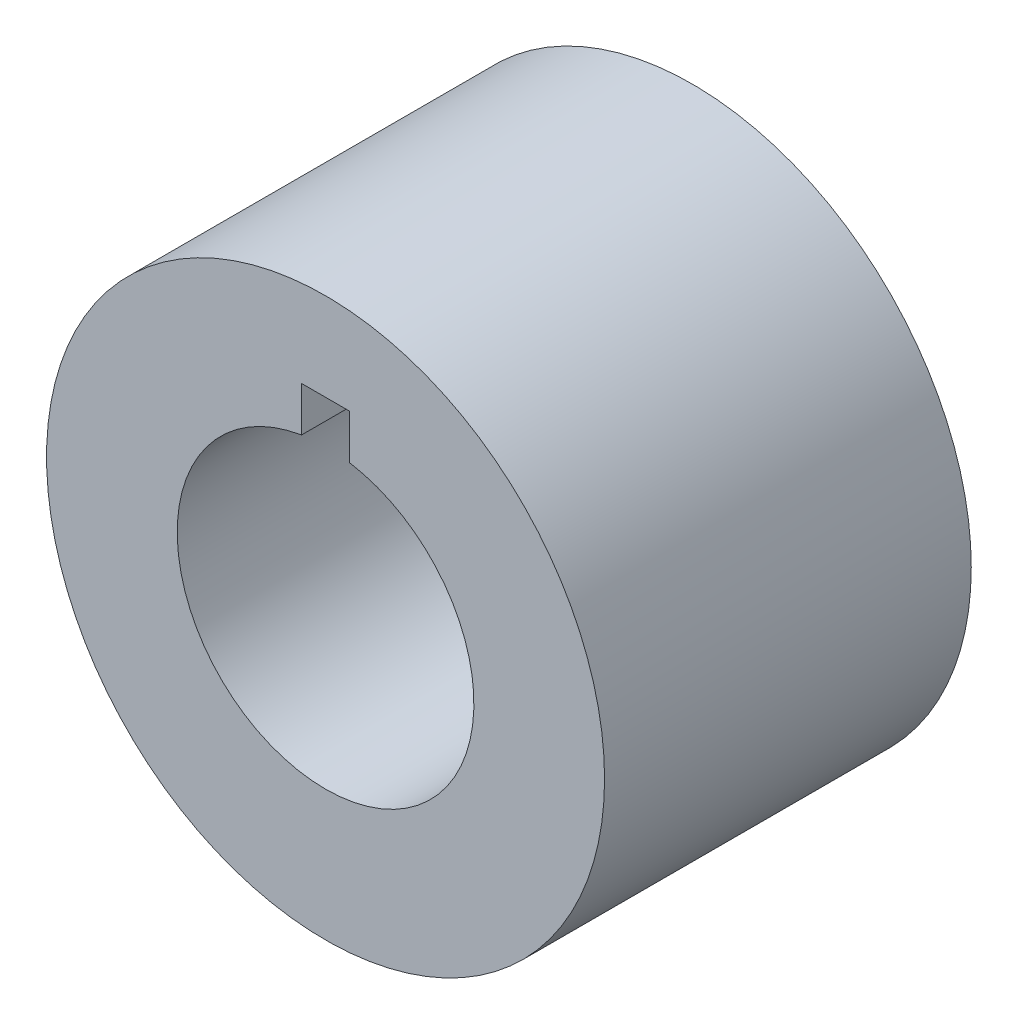
ISO-10303-21;
HEADER;
FILE_DESCRIPTION(('STEP AP214'),'2;1');
FILE_NAME('part.step','',(''),(''),'','','');
FILE_SCHEMA(('AUTOMOTIVE_DESIGN { 1 0 10303 214 1 1 1 1 }'));
ENDSEC;
DATA;
#1=APPLICATION_CONTEXT('core data for automotive mechanical design processes');
#2=APPLICATION_PROTOCOL_DEFINITION('international standard','automotive_design',2000,#1);
#3=PRODUCT_CONTEXT('',#1,'mechanical');
#4=PRODUCT('Part','Part','',(#3));
#5=PRODUCT_RELATED_PRODUCT_CATEGORY('part','',(#4));
#6=PRODUCT_DEFINITION_FORMATION('','',#4);
#7=PRODUCT_DEFINITION_CONTEXT('part definition',#1,'design');
#8=PRODUCT_DEFINITION('design','',#6,#7);
#9=PRODUCT_DEFINITION_SHAPE('','',#8);
#10=(LENGTH_UNIT() NAMED_UNIT(*) SI_UNIT(.MILLI.,.METRE.));
#11=(NAMED_UNIT(*) PLANE_ANGLE_UNIT() SI_UNIT($,.RADIAN.));
#12=(NAMED_UNIT(*) SI_UNIT($,.STERADIAN.) SOLID_ANGLE_UNIT());
#13=UNCERTAINTY_MEASURE_WITH_UNIT(LENGTH_MEASURE(1.E-05),#10,'distance_accuracy_value','');
#14=(GEOMETRIC_REPRESENTATION_CONTEXT(3) GLOBAL_UNCERTAINTY_ASSIGNED_CONTEXT((#13)) GLOBAL_UNIT_ASSIGNED_CONTEXT((#10,
#11,#12)) REPRESENTATION_CONTEXT('',''));
#15=CARTESIAN_POINT('',(0.,0.,0.));
#16=DIRECTION('',(0.,0.,1.));
#17=DIRECTION('',(1.,0.,0.));
#18=AXIS2_PLACEMENT_3D('',#15,#16,#17);
#19=CARTESIAN_POINT('',(0.,0.,33.8836));
#20=DIRECTION('',(0.,0.,1.));
#21=DIRECTION('',(1.,0.,0.));
#22=AXIS2_PLACEMENT_3D('',#19,#20,#21);
#23=PLANE('',#22);
#24=CARTESIAN_POINT('',(0.,0.,33.8836));
#25=DIRECTION('',(0.,0.,1.));
#26=DIRECTION('',(1.,0.,0.));
#27=AXIS2_PLACEMENT_3D('',#24,#25,#26);
#28=CIRCLE('',#27,25.781);
#29=CARTESIAN_POINT('',(25.781,0.,33.8836));
#30=VERTEX_POINT('',#29);
#31=EDGE_CURVE('E11',#30,#30,#28,.T.);
#32=ORIENTED_EDGE('',*,*,#31,.T.);
#33=EDGE_LOOP('',(#32));
#34=FACE_BOUND('',#33,.T.);
#35=CARTESIAN_POINT('',(0.,0.,33.8836));
#36=DIRECTION('',(0.,0.,1.));
#37=DIRECTION('',(1.,0.,0.));
#38=AXIS2_PLACEMENT_3D('',#35,#36,#37);
#39=CIRCLE('',#38,13.7068835444094);
#40=CARTESIAN_POINT('',(-2.2225,13.5255,33.8836));
#41=VERTEX_POINT('',#40);
#42=CARTESIAN_POINT('',(2.2225,13.5255,33.8836));
#43=VERTEX_POINT('',#42);
#44=EDGE_CURVE('E90',#41,#43,#39,.T.);
#45=ORIENTED_EDGE('',*,*,#44,.F.);
#46=DIRECTION('',(0.,-1.,0.));
#47=VECTOR('',#46,1.);
#48=CARTESIAN_POINT('',(-2.2225,17.653,33.8836));
#49=LINE('',#48,#47);
#50=CARTESIAN_POINT('',(-2.2225,17.653,33.8836));
#51=VERTEX_POINT('',#50);
#52=EDGE_CURVE('E81',#51,#41,#49,.T.);
#53=ORIENTED_EDGE('',*,*,#52,.F.);
#54=DIRECTION('',(-1.,0.,0.));
#55=VECTOR('',#54,1.);
#56=CARTESIAN_POINT('',(-2.2225,17.653,33.8836));
#57=LINE('',#56,#55);
#58=CARTESIAN_POINT('',(2.2225,17.653,33.8836));
#59=VERTEX_POINT('',#58);
#60=EDGE_CURVE('E106',#59,#51,#57,.T.);
#61=ORIENTED_EDGE('',*,*,#60,.F.);
#62=DIRECTION('',(0.,1.,0.));
#63=VECTOR('',#62,1.);
#64=CARTESIAN_POINT('',(2.2225,17.653,33.8836));
#65=LINE('',#64,#63);
#66=EDGE_CURVE('E102',#43,#59,#65,.T.);
#67=ORIENTED_EDGE('',*,*,#66,.F.);
#68=EDGE_LOOP('',(#45,#53,#61,#67));
#69=FACE_BOUND('',#68,.T.);
#70=ADVANCED_FACE('F39',(#34,#69),#23,.T.);
#71=CARTESIAN_POINT('',(0.,0.,0.));
#72=DIRECTION('',(0.,0.,1.));
#73=DIRECTION('',(1.,0.,0.));
#74=AXIS2_PLACEMENT_3D('',#71,#72,#73);
#75=PLANE('',#74);
#76=CARTESIAN_POINT('',(0.,0.,0.));
#77=DIRECTION('',(0.,0.,1.));
#78=DIRECTION('',(1.,0.,0.));
#79=AXIS2_PLACEMENT_3D('',#76,#77,#78);
#80=CIRCLE('',#79,25.781);
#81=CARTESIAN_POINT('',(25.781,0.,0.));
#82=VERTEX_POINT('',#81);
#83=EDGE_CURVE('E43',#82,#82,#80,.T.);
#84=ORIENTED_EDGE('',*,*,#83,.F.);
#85=EDGE_LOOP('',(#84));
#86=FACE_BOUND('',#85,.T.);
#87=DIRECTION('',(0.,-1.,0.));
#88=VECTOR('',#87,1.);
#89=CARTESIAN_POINT('',(-2.2225,17.653,0.));
#90=LINE('',#89,#88);
#91=CARTESIAN_POINT('',(-2.2225,17.653,0.));
#92=VERTEX_POINT('',#91);
#93=CARTESIAN_POINT('',(-2.2225,13.5255,0.));
#94=VERTEX_POINT('',#93);
#95=EDGE_CURVE('E63',#92,#94,#90,.T.);
#96=ORIENTED_EDGE('',*,*,#95,.T.);
#97=CARTESIAN_POINT('',(0.,0.,0.));
#98=DIRECTION('',(0.,0.,1.));
#99=DIRECTION('',(1.,0.,0.));
#100=AXIS2_PLACEMENT_3D('',#97,#98,#99);
#101=CIRCLE('',#100,13.7068835444094);
#102=CARTESIAN_POINT('',(2.2225,13.5255,0.));
#103=VERTEX_POINT('',#102);
#104=EDGE_CURVE('E97',#94,#103,#101,.T.);
#105=ORIENTED_EDGE('',*,*,#104,.T.);
#106=DIRECTION('',(0.,1.,0.));
#107=VECTOR('',#106,1.);
#108=CARTESIAN_POINT('',(2.2225,17.653,0.));
#109=LINE('',#108,#107);
#110=CARTESIAN_POINT('',(2.2225,17.653,0.));
#111=VERTEX_POINT('',#110);
#112=EDGE_CURVE('E115',#103,#111,#109,.T.);
#113=ORIENTED_EDGE('',*,*,#112,.T.);
#114=DIRECTION('',(-1.,0.,0.));
#115=VECTOR('',#114,1.);
#116=CARTESIAN_POINT('',(-2.2225,17.653,0.));
#117=LINE('',#116,#115);
#118=EDGE_CURVE('E91',#111,#92,#117,.T.);
#119=ORIENTED_EDGE('',*,*,#118,.T.);
#120=EDGE_LOOP('',(#96,#105,#113,#119));
#121=FACE_BOUND('',#120,.T.);
#122=ADVANCED_FACE('F131',(#86,#121),#75,.F.);
#123=CARTESIAN_POINT('',(0.,0.,33.8836));
#124=DIRECTION('',(0.,0.,-1.));
#125=DIRECTION('',(-1.,0.,0.));
#126=AXIS2_PLACEMENT_3D('',#123,#124,#125);
#127=CYLINDRICAL_SURFACE('',#126,25.781);
#128=ORIENTED_EDGE('',*,*,#31,.F.);
#129=EDGE_LOOP('',(#128));
#130=FACE_BOUND('',#129,.T.);
#131=ORIENTED_EDGE('',*,*,#83,.T.);
#132=EDGE_LOOP('',(#131));
#133=FACE_BOUND('',#132,.T.);
#134=ADVANCED_FACE('F41',(#130,#133),#127,.T.);
#135=CARTESIAN_POINT('',(-2.2225,17.653,33.8836));
#136=DIRECTION('',(1.,0.,0.));
#137=DIRECTION('',(0.,0.,-1.));
#138=AXIS2_PLACEMENT_3D('',#135,#136,#137);
#139=PLANE('',#138);
#140=ORIENTED_EDGE('',*,*,#95,.F.);
#141=DIRECTION('',(0.,0.,-1.));
#142=VECTOR('',#141,1.);
#143=CARTESIAN_POINT('',(-2.2225,17.653,33.8836));
#144=LINE('',#143,#142);
#145=EDGE_CURVE('E85',#51,#92,#144,.T.);
#146=ORIENTED_EDGE('',*,*,#145,.F.);
#147=ORIENTED_EDGE('',*,*,#52,.T.);
#148=DIRECTION('',(0.,0.,-1.));
#149=VECTOR('',#148,1.);
#150=CARTESIAN_POINT('',(-2.2225,13.5255,33.8836));
#151=LINE('',#150,#149);
#152=EDGE_CURVE('E84',#41,#94,#151,.T.);
#153=ORIENTED_EDGE('',*,*,#152,.T.);
#154=EDGE_LOOP('',(#140,#146,#147,#153));
#155=FACE_BOUND('',#154,.T.);
#156=ADVANCED_FACE('F83',(#155),#139,.T.);
#157=CARTESIAN_POINT('',(0.,0.,33.8836));
#158=DIRECTION('',(0.,0.,-1.));
#159=DIRECTION('',(-1.,0.,0.));
#160=AXIS2_PLACEMENT_3D('',#157,#158,#159);
#161=CYLINDRICAL_SURFACE('',#160,13.7068835444094);
#162=ORIENTED_EDGE('',*,*,#104,.F.);
#163=ORIENTED_EDGE('',*,*,#152,.F.);
#164=ORIENTED_EDGE('',*,*,#44,.T.);
#165=DIRECTION('',(0.,0.,-1.));
#166=VECTOR('',#165,1.);
#167=CARTESIAN_POINT('',(2.2225,13.5255,33.8836));
#168=LINE('',#167,#166);
#169=EDGE_CURVE('E99',#43,#103,#168,.T.);
#170=ORIENTED_EDGE('',*,*,#169,.T.);
#171=EDGE_LOOP('',(#162,#163,#164,#170));
#172=FACE_BOUND('',#171,.T.);
#173=ADVANCED_FACE('F94',(#172),#161,.F.);
#174=CARTESIAN_POINT('',(2.2225,17.653,33.8836));
#175=DIRECTION('',(-1.,0.,0.));
#176=DIRECTION('',(0.,0.,1.));
#177=AXIS2_PLACEMENT_3D('',#174,#175,#176);
#178=PLANE('',#177);
#179=ORIENTED_EDGE('',*,*,#112,.F.);
#180=ORIENTED_EDGE('',*,*,#169,.F.);
#181=ORIENTED_EDGE('',*,*,#66,.T.);
#182=DIRECTION('',(0.,0.,-1.));
#183=VECTOR('',#182,1.);
#184=CARTESIAN_POINT('',(2.2225,17.653,33.8836));
#185=LINE('',#184,#183);
#186=EDGE_CURVE('E55',#59,#111,#185,.T.);
#187=ORIENTED_EDGE('',*,*,#186,.T.);
#188=EDGE_LOOP('',(#179,#180,#181,#187));
#189=FACE_BOUND('',#188,.T.);
#190=ADVANCED_FACE('F129',(#189),#178,.T.);
#191=CARTESIAN_POINT('',(-2.2225,17.653,33.8836));
#192=DIRECTION('',(0.,-1.,0.));
#193=DIRECTION('',(0.,0.,-1.));
#194=AXIS2_PLACEMENT_3D('',#191,#192,#193);
#195=PLANE('',#194);
#196=ORIENTED_EDGE('',*,*,#118,.F.);
#197=ORIENTED_EDGE('',*,*,#186,.F.);
#198=ORIENTED_EDGE('',*,*,#60,.T.);
#199=ORIENTED_EDGE('',*,*,#145,.T.);
#200=EDGE_LOOP('',(#196,#197,#198,#199));
#201=FACE_BOUND('',#200,.T.);
#202=ADVANCED_FACE('F132',(#201),#195,.T.);
#203=CLOSED_SHELL('',(#70,#122,#134,#156,#173,#190,#202));
#204=MANIFOLD_SOLID_BREP('B2',#203);
#205=ADVANCED_BREP_SHAPE_REPRESENTATION('',(#18,#204),#14);
#206=SHAPE_DEFINITION_REPRESENTATION(#9,#205);
ENDSEC;
END-ISO-10303-21;
